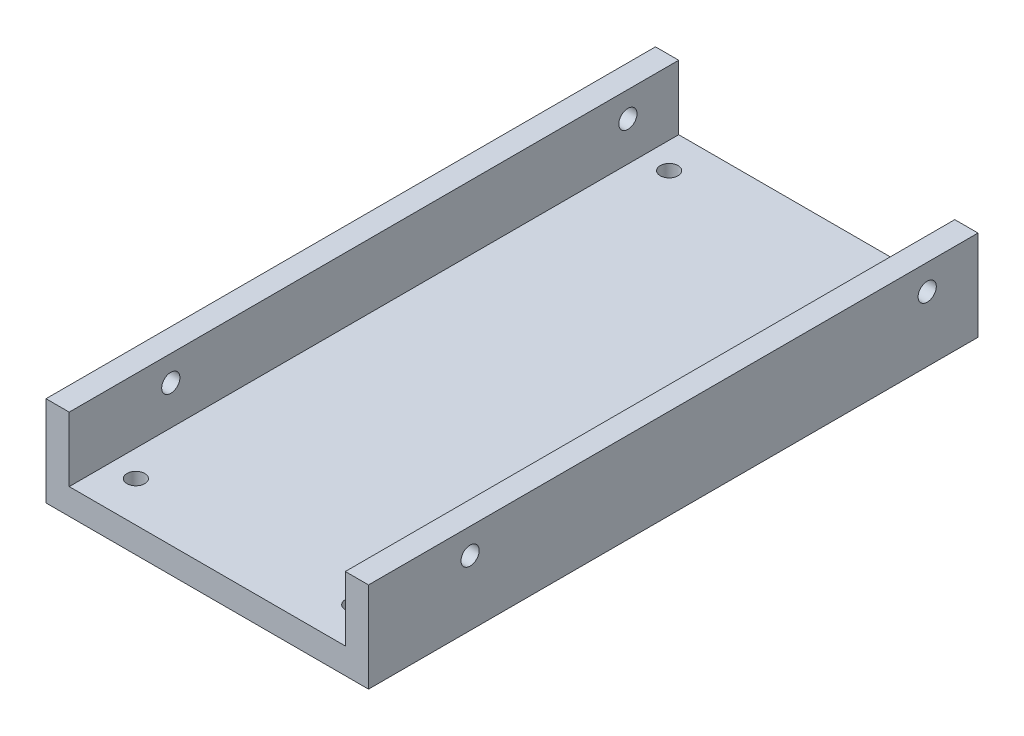
ISO-10303-21;
HEADER;
FILE_DESCRIPTION(('STEP AP214'),'2;1');
FILE_NAME('part.step','',(''),(''),'','','');
FILE_SCHEMA(('AUTOMOTIVE_DESIGN { 1 0 10303 214 1 1 1 1 }'));
ENDSEC;
DATA;
#1=APPLICATION_CONTEXT('core data for automotive mechanical design processes');
#2=APPLICATION_PROTOCOL_DEFINITION('international standard','automotive_design',2000,#1);
#3=PRODUCT_CONTEXT('',#1,'mechanical');
#4=PRODUCT('Part','Part','',(#3));
#5=PRODUCT_RELATED_PRODUCT_CATEGORY('part','',(#4));
#6=PRODUCT_DEFINITION_FORMATION('','',#4);
#7=PRODUCT_DEFINITION_CONTEXT('part definition',#1,'design');
#8=PRODUCT_DEFINITION('design','',#6,#7);
#9=PRODUCT_DEFINITION_SHAPE('','',#8);
#10=(LENGTH_UNIT() NAMED_UNIT(*) SI_UNIT(.MILLI.,.METRE.));
#11=(NAMED_UNIT(*) PLANE_ANGLE_UNIT() SI_UNIT($,.RADIAN.));
#12=(NAMED_UNIT(*) SI_UNIT($,.STERADIAN.) SOLID_ANGLE_UNIT());
#13=UNCERTAINTY_MEASURE_WITH_UNIT(LENGTH_MEASURE(1.E-05),#10,'distance_accuracy_value','');
#14=(GEOMETRIC_REPRESENTATION_CONTEXT(3) GLOBAL_UNCERTAINTY_ASSIGNED_CONTEXT((#13)) GLOBAL_UNIT_ASSIGNED_CONTEXT((#10,
#11,#12)) REPRESENTATION_CONTEXT('',''));
#15=CARTESIAN_POINT('',(0.,0.,0.));
#16=DIRECTION('',(0.,0.,1.));
#17=DIRECTION('',(1.,0.,0.));
#18=AXIS2_PLACEMENT_3D('',#15,#16,#17);
#19=CARTESIAN_POINT('',(0.,5.08,0.));
#20=DIRECTION('',(0.,1.,0.));
#21=DIRECTION('',(0.,0.,1.));
#22=AXIS2_PLACEMENT_3D('',#19,#20,#21);
#23=PLANE('',#22);
#24=CARTESIAN_POINT('',(-0.456413510989032,5.08,13.8207044448028));
#25=DIRECTION('',(0.,1.,0.));
#26=DIRECTION('',(0.,0.,1.));
#27=AXIS2_PLACEMENT_3D('',#24,#25,#26);
#28=CIRCLE('',#27,1.75);
#29=CARTESIAN_POINT('',(-0.456413510989032,5.08,15.5707044448028));
#30=VERTEX_POINT('',#29);
#31=EDGE_CURVE('E365',#30,#30,#28,.T.);
#32=ORIENTED_EDGE('',*,*,#31,.F.);
#33=EDGE_LOOP('',(#32));
#34=FACE_BOUND('',#33,.T.);
#35=CARTESIAN_POINT('',(-43.456413510989,5.08,13.8207044448028));
#36=DIRECTION('',(0.,1.,0.));
#37=DIRECTION('',(0.,0.,1.));
#38=AXIS2_PLACEMENT_3D('',#35,#36,#37);
#39=CIRCLE('',#38,1.75);
#40=CARTESIAN_POINT('',(-43.456413510989,5.08,15.5707044448028));
#41=VERTEX_POINT('',#40);
#42=EDGE_CURVE('E375',#41,#41,#39,.T.);
#43=ORIENTED_EDGE('',*,*,#42,.F.);
#44=EDGE_LOOP('',(#43));
#45=FACE_BOUND('',#44,.T.);
#46=CARTESIAN_POINT('',(-0.456413510989032,5.08,-91.1792955551972));
#47=DIRECTION('',(0.,1.,0.));
#48=DIRECTION('',(0.,0.,1.));
#49=AXIS2_PLACEMENT_3D('',#46,#47,#48);
#50=CIRCLE('',#49,1.75);
#51=CARTESIAN_POINT('',(-0.456413510989032,5.08,-89.4292955551972));
#52=VERTEX_POINT('',#51);
#53=EDGE_CURVE('E381',#52,#52,#50,.T.);
#54=ORIENTED_EDGE('',*,*,#53,.F.);
#55=EDGE_LOOP('',(#54));
#56=FACE_BOUND('',#55,.T.);
#57=CARTESIAN_POINT('',(-43.456413510989,5.08,-91.1792955551972));
#58=DIRECTION('',(0.,1.,0.));
#59=DIRECTION('',(0.,0.,1.));
#60=AXIS2_PLACEMENT_3D('',#57,#58,#59);
#61=CIRCLE('',#60,1.75);
#62=CARTESIAN_POINT('',(-43.456413510989,5.08,-89.4292955551972));
#63=VERTEX_POINT('',#62);
#64=EDGE_CURVE('E387',#63,#63,#61,.T.);
#65=ORIENTED_EDGE('',*,*,#64,.F.);
#66=EDGE_LOOP('',(#65));
#67=FACE_BOUND('',#66,.T.);
#68=DIRECTION('',(1.,0.,0.));
#69=VECTOR('',#68,1.);
#70=CARTESIAN_POINT('',(-53.2219877221078,5.08,21.7486168306261));
#71=LINE('',#70,#69);
#72=CARTESIAN_POINT('',(-48.6499877221078,5.08,21.7486168306261));
#73=VERTEX_POINT('',#72);
#74=CARTESIAN_POINT('',(5.70601227789219,5.08,21.7486168306261));
#75=VERTEX_POINT('',#74);
#76=EDGE_CURVE('E55',#73,#75,#71,.T.);
#77=ORIENTED_EDGE('',*,*,#76,.T.);
#78=DIRECTION('',(0.,0.,1.));
#79=VECTOR('',#78,1.);
#80=CARTESIAN_POINT('',(5.70601227789219,5.08,21.7486168306261));
#81=LINE('',#80,#79);
#82=CARTESIAN_POINT('',(5.70601227789219,5.08,-98.2513831693739));
#83=VERTEX_POINT('',#82);
#84=EDGE_CURVE('E50',#83,#75,#81,.T.);
#85=ORIENTED_EDGE('',*,*,#84,.F.);
#86=DIRECTION('',(-1.,0.,0.));
#87=VECTOR('',#86,1.);
#88=CARTESIAN_POINT('',(-53.2219877221078,5.08,-98.2513831693739));
#89=LINE('',#88,#87);
#90=CARTESIAN_POINT('',(-48.6499877221078,5.08,-98.2513831693739));
#91=VERTEX_POINT('',#90);
#92=EDGE_CURVE('E165',#83,#91,#89,.T.);
#93=ORIENTED_EDGE('',*,*,#92,.T.);
#94=DIRECTION('',(0.,0.,-1.));
#95=VECTOR('',#94,1.);
#96=CARTESIAN_POINT('',(-48.6499877221078,5.08,21.7486168306261));
#97=LINE('',#96,#95);
#98=EDGE_CURVE('E135',#73,#91,#97,.T.);
#99=ORIENTED_EDGE('',*,*,#98,.F.);
#100=EDGE_LOOP('',(#77,#85,#93,#99));
#101=FACE_BOUND('',#100,.T.);
#102=ADVANCED_FACE('F33',(#34,#45,#56,#67,#101),#23,.T.);
#103=CARTESIAN_POINT('',(-53.2219877221078,5.08,-98.2513831693739));
#104=DIRECTION('',(1.,0.,0.));
#105=DIRECTION('',(0.,0.,-1.));
#106=AXIS2_PLACEMENT_3D('',#103,#104,#105);
#107=PLANE('',#106);
#108=CARTESIAN_POINT('',(-53.2219877221078,12.78,-88.2513831693739));
#109=DIRECTION('',(1.,0.,0.));
#110=DIRECTION('',(0.,0.,-1.));
#111=AXIS2_PLACEMENT_3D('',#108,#109,#110);
#112=CIRCLE('',#111,1.79097933974504);
#113=CARTESIAN_POINT('',(-53.2219877221078,12.78,-90.0423625091189));
#114=VERTEX_POINT('',#113);
#115=EDGE_CURVE('E393',#114,#114,#112,.F.);
#116=ORIENTED_EDGE('',*,*,#115,.F.);
#117=EDGE_LOOP('',(#116));
#118=FACE_BOUND('',#117,.T.);
#119=CARTESIAN_POINT('',(-53.2219877221078,12.78,1.74861683062612));
#120=DIRECTION('',(1.,0.,0.));
#121=DIRECTION('',(0.,0.,-1.));
#122=AXIS2_PLACEMENT_3D('',#119,#120,#121);
#123=CIRCLE('',#122,1.79097933974504);
#124=CARTESIAN_POINT('',(-53.2219877221078,12.78,-0.0423625091189215));
#125=VERTEX_POINT('',#124);
#126=EDGE_CURVE('E400',#125,#125,#123,.F.);
#127=ORIENTED_EDGE('',*,*,#126,.F.);
#128=EDGE_LOOP('',(#127));
#129=FACE_BOUND('',#128,.T.);
#130=DIRECTION('',(0.,0.,1.));
#131=VECTOR('',#130,1.);
#132=CARTESIAN_POINT('',(-53.2219877221078,0.,-98.2513831693739));
#133=LINE('',#132,#131);
#134=CARTESIAN_POINT('',(-53.2219877221078,0.,-98.2513831693739));
#135=VERTEX_POINT('',#134);
#136=CARTESIAN_POINT('',(-53.2219877221078,0.,21.7486168306261));
#137=VERTEX_POINT('',#136);
#138=EDGE_CURVE('E162',#135,#137,#133,.T.);
#139=ORIENTED_EDGE('',*,*,#138,.T.);
#140=DIRECTION('',(0.,-1.,0.));
#141=VECTOR('',#140,1.);
#142=CARTESIAN_POINT('',(-53.2219877221078,5.08,21.7486168306261));
#143=LINE('',#142,#141);
#144=CARTESIAN_POINT('',(-53.2219877221078,17.78,21.7486168306261));
#145=VERTEX_POINT('',#144);
#146=EDGE_CURVE('E11',#145,#137,#143,.T.);
#147=ORIENTED_EDGE('',*,*,#146,.F.);
#148=DIRECTION('',(0.,0.,1.));
#149=VECTOR('',#148,1.);
#150=CARTESIAN_POINT('',(-53.2219877221078,17.78,21.7486168306261));
#151=LINE('',#150,#149);
#152=CARTESIAN_POINT('',(-53.2219877221078,17.78,-98.2513831693739));
#153=VERTEX_POINT('',#152);
#154=EDGE_CURVE('E136',#153,#145,#151,.T.);
#155=ORIENTED_EDGE('',*,*,#154,.F.);
#156=DIRECTION('',(0.,-1.,0.));
#157=VECTOR('',#156,1.);
#158=CARTESIAN_POINT('',(-53.2219877221078,5.08,-98.2513831693739));
#159=LINE('',#158,#157);
#160=EDGE_CURVE('E108',#153,#135,#159,.T.);
#161=ORIENTED_EDGE('',*,*,#160,.T.);
#162=EDGE_LOOP('',(#139,#147,#155,#161));
#163=FACE_BOUND('',#162,.T.);
#164=ADVANCED_FACE('F35',(#118,#129,#163),#107,.F.);
#165=CARTESIAN_POINT('',(-53.2219877221078,5.08,21.7486168306261));
#166=DIRECTION('',(0.,0.,-1.));
#167=DIRECTION('',(-1.,0.,0.));
#168=AXIS2_PLACEMENT_3D('',#165,#166,#167);
#169=PLANE('',#168);
#170=DIRECTION('',(1.,0.,0.));
#171=VECTOR('',#170,1.);
#172=CARTESIAN_POINT('',(-53.2219877221078,0.,21.7486168306261));
#173=LINE('',#172,#171);
#174=CARTESIAN_POINT('',(10.2780122778922,0.,21.7486168306261));
#175=VERTEX_POINT('',#174);
#176=EDGE_CURVE('E171',#137,#175,#173,.T.);
#177=ORIENTED_EDGE('',*,*,#176,.T.);
#178=DIRECTION('',(0.,-1.,0.));
#179=VECTOR('',#178,1.);
#180=CARTESIAN_POINT('',(10.2780122778922,5.08,21.7486168306261));
#181=LINE('',#180,#179);
#182=CARTESIAN_POINT('',(10.2780122778922,17.78,21.7486168306261));
#183=VERTEX_POINT('',#182);
#184=EDGE_CURVE('E42',#183,#175,#181,.T.);
#185=ORIENTED_EDGE('',*,*,#184,.F.);
#186=DIRECTION('',(1.,0.,0.));
#187=VECTOR('',#186,1.);
#188=CARTESIAN_POINT('',(10.2780122778922,17.78,21.7486168306261));
#189=LINE('',#188,#187);
#190=CARTESIAN_POINT('',(5.70601227789219,17.78,21.7486168306261));
#191=VERTEX_POINT('',#190);
#192=EDGE_CURVE('E122',#191,#183,#189,.T.);
#193=ORIENTED_EDGE('',*,*,#192,.F.);
#194=DIRECTION('',(0.,-1.,0.));
#195=VECTOR('',#194,1.);
#196=CARTESIAN_POINT('',(5.70601227789219,17.78,21.7486168306261));
#197=LINE('',#196,#195);
#198=EDGE_CURVE('E130',#191,#75,#197,.T.);
#199=ORIENTED_EDGE('',*,*,#198,.T.);
#200=ORIENTED_EDGE('',*,*,#76,.F.);
#201=DIRECTION('',(0.,-1.,0.));
#202=VECTOR('',#201,1.);
#203=CARTESIAN_POINT('',(-48.6499877221078,17.78,21.7486168306261));
#204=LINE('',#203,#202);
#205=CARTESIAN_POINT('',(-48.6499877221078,17.78,21.7486168306261));
#206=VERTEX_POINT('',#205);
#207=EDGE_CURVE('E157',#206,#73,#204,.T.);
#208=ORIENTED_EDGE('',*,*,#207,.F.);
#209=DIRECTION('',(1.,0.,0.));
#210=VECTOR('',#209,1.);
#211=CARTESIAN_POINT('',(-53.2219877221078,17.78,21.7486168306261));
#212=LINE('',#211,#210);
#213=EDGE_CURVE('E139',#145,#206,#212,.T.);
#214=ORIENTED_EDGE('',*,*,#213,.F.);
#215=ORIENTED_EDGE('',*,*,#146,.T.);
#216=EDGE_LOOP('',(#177,#185,#193,#199,#200,#208,#214,#215));
#217=FACE_BOUND('',#216,.T.);
#218=ADVANCED_FACE('F193',(#217),#169,.F.);
#219=CARTESIAN_POINT('',(10.2780122778922,5.08,-98.2513831693739));
#220=DIRECTION('',(-1.,0.,0.));
#221=DIRECTION('',(0.,0.,1.));
#222=AXIS2_PLACEMENT_3D('',#219,#220,#221);
#223=PLANE('',#222);
#224=CARTESIAN_POINT('',(10.2780122778922,12.78,-88.2513831693739));
#225=DIRECTION('',(1.,0.,0.));
#226=DIRECTION('',(0.,0.,-1.));
#227=AXIS2_PLACEMENT_3D('',#224,#225,#226);
#228=CIRCLE('',#227,1.79097933974504);
#229=CARTESIAN_POINT('',(10.2780122778922,12.78,-90.0423625091189));
#230=VERTEX_POINT('',#229);
#231=EDGE_CURVE('E390',#230,#230,#228,.T.);
#232=ORIENTED_EDGE('',*,*,#231,.F.);
#233=EDGE_LOOP('',(#232));
#234=FACE_BOUND('',#233,.T.);
#235=CARTESIAN_POINT('',(10.2780122778922,12.78,1.74861683062612));
#236=DIRECTION('',(1.,0.,0.));
#237=DIRECTION('',(0.,0.,-1.));
#238=AXIS2_PLACEMENT_3D('',#235,#236,#237);
#239=CIRCLE('',#238,1.79097933974504);
#240=CARTESIAN_POINT('',(10.2780122778922,12.78,-0.0423625091189215));
#241=VERTEX_POINT('',#240);
#242=EDGE_CURVE('E399',#241,#241,#239,.T.);
#243=ORIENTED_EDGE('',*,*,#242,.F.);
#244=EDGE_LOOP('',(#243));
#245=FACE_BOUND('',#244,.T.);
#246=DIRECTION('',(0.,0.,-1.));
#247=VECTOR('',#246,1.);
#248=CARTESIAN_POINT('',(10.2780122778922,0.,-98.2513831693739));
#249=LINE('',#248,#247);
#250=CARTESIAN_POINT('',(10.2780122778922,0.,-98.2513831693739));
#251=VERTEX_POINT('',#250);
#252=EDGE_CURVE('E105',#175,#251,#249,.T.);
#253=ORIENTED_EDGE('',*,*,#252,.T.);
#254=DIRECTION('',(0.,-1.,0.));
#255=VECTOR('',#254,1.);
#256=CARTESIAN_POINT('',(10.2780122778922,5.08,-98.2513831693739));
#257=LINE('',#256,#255);
#258=CARTESIAN_POINT('',(10.2780122778922,17.78,-98.2513831693739));
#259=VERTEX_POINT('',#258);
#260=EDGE_CURVE('E98',#259,#251,#257,.T.);
#261=ORIENTED_EDGE('',*,*,#260,.F.);
#262=DIRECTION('',(0.,0.,-1.));
#263=VECTOR('',#262,1.);
#264=CARTESIAN_POINT('',(10.2780122778922,17.78,21.7486168306261));
#265=LINE('',#264,#263);
#266=EDGE_CURVE('E103',#183,#259,#265,.T.);
#267=ORIENTED_EDGE('',*,*,#266,.F.);
#268=ORIENTED_EDGE('',*,*,#184,.T.);
#269=EDGE_LOOP('',(#253,#261,#267,#268));
#270=FACE_BOUND('',#269,.T.);
#271=ADVANCED_FACE('F100',(#234,#245,#270),#223,.F.);
#272=CARTESIAN_POINT('',(-53.2219877221078,5.08,-98.2513831693739));
#273=DIRECTION('',(0.,0.,1.));
#274=DIRECTION('',(1.,0.,0.));
#275=AXIS2_PLACEMENT_3D('',#272,#273,#274);
#276=PLANE('',#275);
#277=DIRECTION('',(-1.,0.,0.));
#278=VECTOR('',#277,1.);
#279=CARTESIAN_POINT('',(-53.2219877221078,0.,-98.2513831693739));
#280=LINE('',#279,#278);
#281=EDGE_CURVE('E174',#251,#135,#280,.T.);
#282=ORIENTED_EDGE('',*,*,#281,.T.);
#283=ORIENTED_EDGE('',*,*,#160,.F.);
#284=DIRECTION('',(-1.,0.,0.));
#285=VECTOR('',#284,1.);
#286=CARTESIAN_POINT('',(-53.2219877221078,17.78,-98.2513831693739));
#287=LINE('',#286,#285);
#288=CARTESIAN_POINT('',(-48.6499877221078,17.78,-98.2513831693739));
#289=VERTEX_POINT('',#288);
#290=EDGE_CURVE('E143',#289,#153,#287,.T.);
#291=ORIENTED_EDGE('',*,*,#290,.F.);
#292=DIRECTION('',(0.,-1.,0.));
#293=VECTOR('',#292,1.);
#294=CARTESIAN_POINT('',(-48.6499877221078,17.78,-98.2513831693739));
#295=LINE('',#294,#293);
#296=EDGE_CURVE('E146',#289,#91,#295,.T.);
#297=ORIENTED_EDGE('',*,*,#296,.T.);
#298=ORIENTED_EDGE('',*,*,#92,.F.);
#299=DIRECTION('',(0.,-1.,0.));
#300=VECTOR('',#299,1.);
#301=CARTESIAN_POINT('',(5.70601227789219,17.78,-98.2513831693739));
#302=LINE('',#301,#300);
#303=CARTESIAN_POINT('',(5.70601227789219,17.78,-98.2513831693739));
#304=VERTEX_POINT('',#303);
#305=EDGE_CURVE('E114',#304,#83,#302,.T.);
#306=ORIENTED_EDGE('',*,*,#305,.F.);
#307=DIRECTION('',(-1.,0.,0.));
#308=VECTOR('',#307,1.);
#309=CARTESIAN_POINT('',(10.2780122778922,17.78,-98.2513831693739));
#310=LINE('',#309,#308);
#311=EDGE_CURVE('E111',#259,#304,#310,.T.);
#312=ORIENTED_EDGE('',*,*,#311,.F.);
#313=ORIENTED_EDGE('',*,*,#260,.T.);
#314=EDGE_LOOP('',(#282,#283,#291,#297,#298,#306,#312,#313));
#315=FACE_BOUND('',#314,.T.);
#316=ADVANCED_FACE('F112',(#315),#276,.F.);
#317=CARTESIAN_POINT('',(0.,0.,0.));
#318=DIRECTION('',(0.,1.,0.));
#319=DIRECTION('',(0.,0.,1.));
#320=AXIS2_PLACEMENT_3D('',#317,#318,#319);
#321=PLANE('',#320);
#322=CARTESIAN_POINT('',(-0.456413510989032,0.,13.8207044448028));
#323=DIRECTION('',(0.,-1.,0.));
#324=DIRECTION('',(0.,0.,-1.));
#325=AXIS2_PLACEMENT_3D('',#322,#323,#324);
#326=CIRCLE('',#325,1.75);
#327=CARTESIAN_POINT('',(-0.456413510989032,0.,12.0707044448028));
#328=VERTEX_POINT('',#327);
#329=EDGE_CURVE('E368',#328,#328,#326,.T.);
#330=ORIENTED_EDGE('',*,*,#329,.F.);
#331=EDGE_LOOP('',(#330));
#332=FACE_BOUND('',#331,.T.);
#333=CARTESIAN_POINT('',(-43.456413510989,0.,13.8207044448028));
#334=DIRECTION('',(0.,-1.,0.));
#335=DIRECTION('',(0.,0.,-1.));
#336=AXIS2_PLACEMENT_3D('',#333,#334,#335);
#337=CIRCLE('',#336,1.75);
#338=CARTESIAN_POINT('',(-43.456413510989,0.,12.0707044448028));
#339=VERTEX_POINT('',#338);
#340=EDGE_CURVE('E370',#339,#339,#337,.T.);
#341=ORIENTED_EDGE('',*,*,#340,.F.);
#342=EDGE_LOOP('',(#341));
#343=FACE_BOUND('',#342,.T.);
#344=CARTESIAN_POINT('',(-0.456413510989032,0.,-91.1792955551972));
#345=DIRECTION('',(0.,-1.,0.));
#346=DIRECTION('',(0.,0.,-1.));
#347=AXIS2_PLACEMENT_3D('',#344,#345,#346);
#348=CIRCLE('',#347,1.75);
#349=CARTESIAN_POINT('',(-0.456413510989032,0.,-92.9292955551972));
#350=VERTEX_POINT('',#349);
#351=EDGE_CURVE('E378',#350,#350,#348,.T.);
#352=ORIENTED_EDGE('',*,*,#351,.F.);
#353=EDGE_LOOP('',(#352));
#354=FACE_BOUND('',#353,.T.);
#355=CARTESIAN_POINT('',(-43.456413510989,0.,-91.1792955551972));
#356=DIRECTION('',(0.,-1.,0.));
#357=DIRECTION('',(0.,0.,-1.));
#358=AXIS2_PLACEMENT_3D('',#355,#356,#357);
#359=CIRCLE('',#358,1.75);
#360=CARTESIAN_POINT('',(-43.456413510989,0.,-92.9292955551972));
#361=VERTEX_POINT('',#360);
#362=EDGE_CURVE('E384',#361,#361,#359,.T.);
#363=ORIENTED_EDGE('',*,*,#362,.F.);
#364=EDGE_LOOP('',(#363));
#365=FACE_BOUND('',#364,.T.);
#366=ORIENTED_EDGE('',*,*,#138,.F.);
#367=ORIENTED_EDGE('',*,*,#281,.F.);
#368=ORIENTED_EDGE('',*,*,#252,.F.);
#369=ORIENTED_EDGE('',*,*,#176,.F.);
#370=EDGE_LOOP('',(#366,#367,#368,#369));
#371=FACE_BOUND('',#370,.T.);
#372=ADVANCED_FACE('F181',(#332,#343,#354,#365,#371),#321,.F.);
#373=CARTESIAN_POINT('',(-48.6499877221078,17.78,21.7486168306261));
#374=DIRECTION('',(-1.,0.,0.));
#375=DIRECTION('',(0.,0.,1.));
#376=AXIS2_PLACEMENT_3D('',#373,#374,#375);
#377=PLANE('',#376);
#378=CARTESIAN_POINT('',(-48.6499877221078,12.78,-88.2513831693739));
#379=DIRECTION('',(-1.,0.,0.));
#380=DIRECTION('',(0.,0.,1.));
#381=AXIS2_PLACEMENT_3D('',#378,#379,#380);
#382=CIRCLE('',#381,1.79097933974504);
#383=CARTESIAN_POINT('',(-48.6499877221078,12.78,-86.4604038296288));
#384=VERTEX_POINT('',#383);
#385=EDGE_CURVE('E396',#384,#384,#382,.T.);
#386=ORIENTED_EDGE('',*,*,#385,.T.);
#387=EDGE_LOOP('',(#386));
#388=FACE_BOUND('',#387,.T.);
#389=CARTESIAN_POINT('',(-48.6499877221078,12.78,1.74861683062612));
#390=DIRECTION('',(-1.,0.,0.));
#391=DIRECTION('',(0.,0.,1.));
#392=AXIS2_PLACEMENT_3D('',#389,#390,#391);
#393=CIRCLE('',#392,1.79097933974504);
#394=CARTESIAN_POINT('',(-48.6499877221078,12.78,3.53959617037115));
#395=VERTEX_POINT('',#394);
#396=EDGE_CURVE('E124',#395,#395,#393,.T.);
#397=ORIENTED_EDGE('',*,*,#396,.T.);
#398=EDGE_LOOP('',(#397));
#399=FACE_BOUND('',#398,.T.);
#400=ORIENTED_EDGE('',*,*,#98,.T.);
#401=ORIENTED_EDGE('',*,*,#296,.F.);
#402=DIRECTION('',(0.,0.,-1.));
#403=VECTOR('',#402,1.);
#404=CARTESIAN_POINT('',(-48.6499877221078,17.78,21.7486168306261));
#405=LINE('',#404,#403);
#406=EDGE_CURVE('E141',#206,#289,#405,.T.);
#407=ORIENTED_EDGE('',*,*,#406,.F.);
#408=ORIENTED_EDGE('',*,*,#207,.T.);
#409=EDGE_LOOP('',(#400,#401,#407,#408));
#410=FACE_BOUND('',#409,.T.);
#411=ADVANCED_FACE('F192',(#388,#399,#410),#377,.F.);
#412=CARTESIAN_POINT('',(0.,17.78,0.));
#413=DIRECTION('',(0.,-1.,0.));
#414=DIRECTION('',(0.,0.,-1.));
#415=AXIS2_PLACEMENT_3D('',#412,#413,#414);
#416=PLANE('',#415);
#417=ORIENTED_EDGE('',*,*,#154,.T.);
#418=ORIENTED_EDGE('',*,*,#213,.T.);
#419=ORIENTED_EDGE('',*,*,#406,.T.);
#420=ORIENTED_EDGE('',*,*,#290,.T.);
#421=EDGE_LOOP('',(#417,#418,#419,#420));
#422=FACE_BOUND('',#421,.T.);
#423=ADVANCED_FACE('F187',(#422),#416,.F.);
#424=CARTESIAN_POINT('',(5.70601227789219,17.78,21.7486168306261));
#425=DIRECTION('',(1.,0.,0.));
#426=DIRECTION('',(0.,0.,-1.));
#427=AXIS2_PLACEMENT_3D('',#424,#425,#426);
#428=PLANE('',#427);
#429=CARTESIAN_POINT('',(5.70601227789219,12.78,-88.2513831693739));
#430=DIRECTION('',(1.,0.,0.));
#431=DIRECTION('',(0.,0.,-1.));
#432=AXIS2_PLACEMENT_3D('',#429,#430,#431);
#433=CIRCLE('',#432,1.79097933974504);
#434=CARTESIAN_POINT('',(5.70601227789219,12.78,-90.0423625091189));
#435=VERTEX_POINT('',#434);
#436=EDGE_CURVE('E37',#435,#435,#433,.T.);
#437=ORIENTED_EDGE('',*,*,#436,.T.);
#438=EDGE_LOOP('',(#437));
#439=FACE_BOUND('',#438,.T.);
#440=CARTESIAN_POINT('',(5.70601227789219,12.78,1.74861683062612));
#441=DIRECTION('',(1.,0.,0.));
#442=DIRECTION('',(0.,0.,-1.));
#443=AXIS2_PLACEMENT_3D('',#440,#441,#442);
#444=CIRCLE('',#443,1.79097933974504);
#445=CARTESIAN_POINT('',(5.70601227789219,12.78,-0.0423625091189215));
#446=VERTEX_POINT('',#445);
#447=EDGE_CURVE('E166',#446,#446,#444,.T.);
#448=ORIENTED_EDGE('',*,*,#447,.T.);
#449=EDGE_LOOP('',(#448));
#450=FACE_BOUND('',#449,.T.);
#451=ORIENTED_EDGE('',*,*,#84,.T.);
#452=ORIENTED_EDGE('',*,*,#198,.F.);
#453=DIRECTION('',(0.,0.,1.));
#454=VECTOR('',#453,1.);
#455=CARTESIAN_POINT('',(5.70601227789219,17.78,21.7486168306261));
#456=LINE('',#455,#454);
#457=EDGE_CURVE('E117',#304,#191,#456,.T.);
#458=ORIENTED_EDGE('',*,*,#457,.F.);
#459=ORIENTED_EDGE('',*,*,#305,.T.);
#460=EDGE_LOOP('',(#451,#452,#458,#459));
#461=FACE_BOUND('',#460,.T.);
#462=ADVANCED_FACE('F196',(#439,#450,#461),#428,.F.);
#463=CARTESIAN_POINT('',(0.,17.78,0.));
#464=DIRECTION('',(0.,1.,0.));
#465=DIRECTION('',(0.,0.,1.));
#466=AXIS2_PLACEMENT_3D('',#463,#464,#465);
#467=PLANE('',#466);
#468=ORIENTED_EDGE('',*,*,#266,.T.);
#469=ORIENTED_EDGE('',*,*,#311,.T.);
#470=ORIENTED_EDGE('',*,*,#457,.T.);
#471=ORIENTED_EDGE('',*,*,#192,.T.);
#472=EDGE_LOOP('',(#468,#469,#470,#471));
#473=FACE_BOUND('',#472,.T.);
#474=ADVANCED_FACE('F120',(#473),#467,.T.);
#475=CARTESIAN_POINT('',(-58.2876422665027,12.78,1.74861683062612));
#476=DIRECTION('',(1.,0.,0.));
#477=DIRECTION('',(0.,0.,-1.));
#478=AXIS2_PLACEMENT_3D('',#475,#476,#477);
#479=CYLINDRICAL_SURFACE('',#478,1.79097933974504);
#480=ORIENTED_EDGE('',*,*,#242,.T.);
#481=EDGE_LOOP('',(#480));
#482=FACE_BOUND('',#481,.T.);
#483=ORIENTED_EDGE('',*,*,#447,.F.);
#484=EDGE_LOOP('',(#483));
#485=FACE_BOUND('',#484,.T.);
#486=ADVANCED_FACE('F204',(#482,#485),#479,.F.);
#487=ORIENTED_EDGE('',*,*,#126,.T.);
#488=EDGE_LOOP('',(#487));
#489=FACE_BOUND('',#488,.T.);
#490=ORIENTED_EDGE('',*,*,#396,.F.);
#491=EDGE_LOOP('',(#490));
#492=FACE_BOUND('',#491,.T.);
#493=ADVANCED_FACE('F323',(#489,#492),#479,.F.);
#494=CARTESIAN_POINT('',(-58.2876422665027,12.78,-88.2513831693739));
#495=DIRECTION('',(1.,0.,0.));
#496=DIRECTION('',(0.,0.,-1.));
#497=AXIS2_PLACEMENT_3D('',#494,#495,#496);
#498=CYLINDRICAL_SURFACE('',#497,1.79097933974504);
#499=ORIENTED_EDGE('',*,*,#231,.T.);
#500=EDGE_LOOP('',(#499));
#501=FACE_BOUND('',#500,.T.);
#502=ORIENTED_EDGE('',*,*,#436,.F.);
#503=EDGE_LOOP('',(#502));
#504=FACE_BOUND('',#503,.T.);
#505=ADVANCED_FACE('F311',(#501,#504),#498,.F.);
#506=ORIENTED_EDGE('',*,*,#115,.T.);
#507=EDGE_LOOP('',(#506));
#508=FACE_BOUND('',#507,.T.);
#509=ORIENTED_EDGE('',*,*,#385,.F.);
#510=EDGE_LOOP('',(#509));
#511=FACE_BOUND('',#510,.T.);
#512=ADVANCED_FACE('F305',(#508,#511),#498,.F.);
#513=CARTESIAN_POINT('',(-43.456413510989,17.780025,-91.1792955551972));
#514=DIRECTION('',(0.,-1.,0.));
#515=DIRECTION('',(0.,0.,-1.));
#516=AXIS2_PLACEMENT_3D('',#513,#514,#515);
#517=CYLINDRICAL_SURFACE('',#516,1.75);
#518=ORIENTED_EDGE('',*,*,#64,.T.);
#519=EDGE_LOOP('',(#518));
#520=FACE_BOUND('',#519,.T.);
#521=ORIENTED_EDGE('',*,*,#362,.T.);
#522=EDGE_LOOP('',(#521));
#523=FACE_BOUND('',#522,.T.);
#524=ADVANCED_FACE('F310',(#520,#523),#517,.F.);
#525=CARTESIAN_POINT('',(-0.456413510989032,17.780025,-91.1792955551972));
#526=DIRECTION('',(0.,-1.,0.));
#527=DIRECTION('',(0.,0.,-1.));
#528=AXIS2_PLACEMENT_3D('',#525,#526,#527);
#529=CYLINDRICAL_SURFACE('',#528,1.75);
#530=ORIENTED_EDGE('',*,*,#53,.T.);
#531=EDGE_LOOP('',(#530));
#532=FACE_BOUND('',#531,.T.);
#533=ORIENTED_EDGE('',*,*,#351,.T.);
#534=EDGE_LOOP('',(#533));
#535=FACE_BOUND('',#534,.T.);
#536=ADVANCED_FACE('F349',(#532,#535),#529,.F.);
#537=CARTESIAN_POINT('',(-43.456413510989,17.780025,13.8207044448028));
#538=DIRECTION('',(0.,-1.,0.));
#539=DIRECTION('',(0.,0.,-1.));
#540=AXIS2_PLACEMENT_3D('',#537,#538,#539);
#541=CYLINDRICAL_SURFACE('',#540,1.75);
#542=ORIENTED_EDGE('',*,*,#42,.T.);
#543=EDGE_LOOP('',(#542));
#544=FACE_BOUND('',#543,.T.);
#545=ORIENTED_EDGE('',*,*,#340,.T.);
#546=EDGE_LOOP('',(#545));
#547=FACE_BOUND('',#546,.T.);
#548=ADVANCED_FACE('F353',(#544,#547),#541,.F.);
#549=CARTESIAN_POINT('',(-0.456413510989032,17.780025,13.8207044448028));
#550=DIRECTION('',(0.,-1.,0.));
#551=DIRECTION('',(0.,0.,-1.));
#552=AXIS2_PLACEMENT_3D('',#549,#550,#551);
#553=CYLINDRICAL_SURFACE('',#552,1.75);
#554=ORIENTED_EDGE('',*,*,#31,.T.);
#555=EDGE_LOOP('',(#554));
#556=FACE_BOUND('',#555,.T.);
#557=ORIENTED_EDGE('',*,*,#329,.T.);
#558=EDGE_LOOP('',(#557));
#559=FACE_BOUND('',#558,.T.);
#560=ADVANCED_FACE('F357',(#556,#559),#553,.F.);
#561=CLOSED_SHELL('',(#102,#164,#218,#271,#316,#372,#411,#423,#462,#474,#486,#493,#505,#512,
#524,#536,#548,#560));
#562=MANIFOLD_SOLID_BREP('B2',#561);
#563=ADVANCED_BREP_SHAPE_REPRESENTATION('',(#18,#562),#14);
#564=SHAPE_DEFINITION_REPRESENTATION(#9,#563);
ENDSEC;
END-ISO-10303-21;
